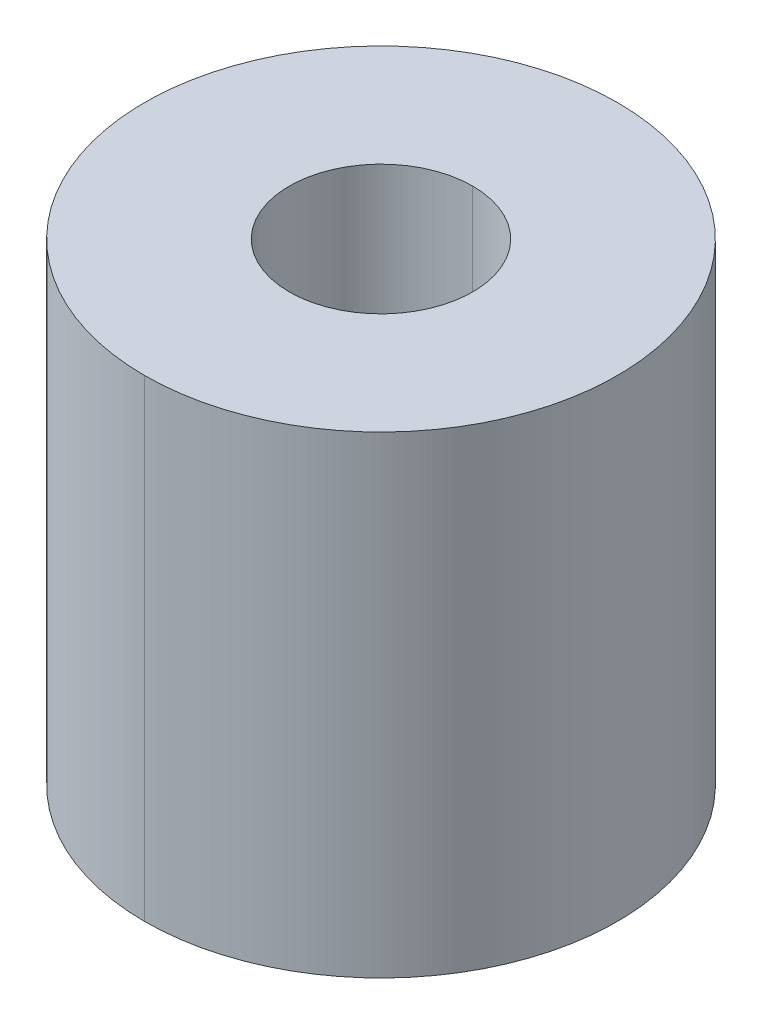
ISO-10303-21;
HEADER;
FILE_DESCRIPTION(('STEP AP214'),'2;1');
FILE_NAME('part.step','',(''),(''),'','','');
FILE_SCHEMA(('AUTOMOTIVE_DESIGN { 1 0 10303 214 1 1 1 1 }'));
ENDSEC;
DATA;
#1=APPLICATION_CONTEXT('core data for automotive mechanical design processes');
#2=APPLICATION_PROTOCOL_DEFINITION('international standard','automotive_design',2000,#1);
#3=PRODUCT_CONTEXT('',#1,'mechanical');
#4=PRODUCT('Part','Part','',(#3));
#5=PRODUCT_RELATED_PRODUCT_CATEGORY('part','',(#4));
#6=PRODUCT_DEFINITION_FORMATION('','',#4);
#7=PRODUCT_DEFINITION_CONTEXT('part definition',#1,'design');
#8=PRODUCT_DEFINITION('design','',#6,#7);
#9=PRODUCT_DEFINITION_SHAPE('','',#8);
#10=(LENGTH_UNIT() NAMED_UNIT(*) SI_UNIT(.MILLI.,.METRE.));
#11=(NAMED_UNIT(*) PLANE_ANGLE_UNIT() SI_UNIT($,.RADIAN.));
#12=(NAMED_UNIT(*) SI_UNIT($,.STERADIAN.) SOLID_ANGLE_UNIT());
#13=UNCERTAINTY_MEASURE_WITH_UNIT(LENGTH_MEASURE(1.E-05),#10,'distance_accuracy_value','');
#14=(GEOMETRIC_REPRESENTATION_CONTEXT(3) GLOBAL_UNCERTAINTY_ASSIGNED_CONTEXT((#13)) GLOBAL_UNIT_ASSIGNED_CONTEXT((#10,
#11,#12)) REPRESENTATION_CONTEXT('',''));
#15=CARTESIAN_POINT('',(0.,0.,0.));
#16=DIRECTION('',(0.,0.,1.));
#17=DIRECTION('',(1.,0.,0.));
#18=AXIS2_PLACEMENT_3D('',#15,#16,#17);
#19=CARTESIAN_POINT('',(0.,-6.35,0.));
#20=DIRECTION('',(0.,1.,0.));
#21=DIRECTION('',(1.,0.,0.));
#22=AXIS2_PLACEMENT_3D('',#19,#20,#21);
#23=PLANE('',#22);
#24=CARTESIAN_POINT('',(0.,-6.35,0.));
#25=DIRECTION('',(0.,1.,0.));
#26=DIRECTION('',(0.,0.,1.));
#27=AXIS2_PLACEMENT_3D('',#24,#25,#26);
#28=CIRCLE('',#27,2.4638);
#29=CARTESIAN_POINT('',(0.,-6.35,-2.4638));
#30=VERTEX_POINT('',#29);
#31=CARTESIAN_POINT('',(0.,-6.35,2.4638));
#32=VERTEX_POINT('',#31);
#33=EDGE_CURVE('E11',#30,#32,#28,.T.);
#34=ORIENTED_EDGE('',*,*,#33,.T.);
#35=CARTESIAN_POINT('',(0.,-6.35,0.));
#36=DIRECTION('',(0.,1.,0.));
#37=DIRECTION('',(0.,0.,1.));
#38=AXIS2_PLACEMENT_3D('',#35,#36,#37);
#39=CIRCLE('',#38,2.4638);
#40=EDGE_CURVE('E27',#32,#30,#39,.T.);
#41=ORIENTED_EDGE('',*,*,#40,.T.);
#42=EDGE_LOOP('',(#34,#41));
#43=FACE_BOUND('',#42,.T.);
#44=CARTESIAN_POINT('',(0.,-6.35,0.));
#45=DIRECTION('',(0.,1.,0.));
#46=DIRECTION('',(0.,0.,1.));
#47=AXIS2_PLACEMENT_3D('',#44,#45,#46);
#48=CIRCLE('',#47,6.35);
#49=CARTESIAN_POINT('',(0.,-6.35,-6.35));
#50=VERTEX_POINT('',#49);
#51=CARTESIAN_POINT('',(0.,-6.35,6.35));
#52=VERTEX_POINT('',#51);
#53=EDGE_CURVE('E75',#50,#52,#48,.T.);
#54=ORIENTED_EDGE('',*,*,#53,.F.);
#55=CARTESIAN_POINT('',(0.,-6.35,0.));
#56=DIRECTION('',(0.,1.,0.));
#57=DIRECTION('',(0.,0.,1.));
#58=AXIS2_PLACEMENT_3D('',#55,#56,#57);
#59=CIRCLE('',#58,6.35);
#60=EDGE_CURVE('E64',#52,#50,#59,.T.);
#61=ORIENTED_EDGE('',*,*,#60,.F.);
#62=EDGE_LOOP('',(#54,#61));
#63=FACE_BOUND('',#62,.T.);
#64=ADVANCED_FACE('F16',(#43,#63),#23,.F.);
#65=CARTESIAN_POINT('',(0.,6.35,0.));
#66=DIRECTION('',(0.,-1.,0.));
#67=DIRECTION('',(0.,0.,-1.));
#68=AXIS2_PLACEMENT_3D('',#65,#66,#67);
#69=CYLINDRICAL_SURFACE('',#68,2.4638);
#70=CARTESIAN_POINT('',(0.,6.35,0.));
#71=DIRECTION('',(0.,1.,0.));
#72=DIRECTION('',(0.,0.,1.));
#73=AXIS2_PLACEMENT_3D('',#70,#71,#72);
#74=CIRCLE('',#73,2.4638);
#75=CARTESIAN_POINT('',(0.,6.35,-2.4638));
#76=VERTEX_POINT('',#75);
#77=CARTESIAN_POINT('',(0.,6.35,2.4638));
#78=VERTEX_POINT('',#77);
#79=EDGE_CURVE('E97',#76,#78,#74,.T.);
#80=ORIENTED_EDGE('',*,*,#79,.T.);
#81=DIRECTION('',(0.,-1.,0.));
#82=VECTOR('',#81,1.);
#83=CARTESIAN_POINT('',(0.,6.35,2.4638));
#84=LINE('',#83,#82);
#85=EDGE_CURVE('E74',#78,#32,#84,.T.);
#86=ORIENTED_EDGE('',*,*,#85,.T.);
#87=ORIENTED_EDGE('',*,*,#33,.F.);
#88=DIRECTION('',(0.,-1.,0.));
#89=VECTOR('',#88,1.);
#90=CARTESIAN_POINT('',(0.,6.35,-2.4638));
#91=LINE('',#90,#89);
#92=EDGE_CURVE('E100',#76,#30,#91,.T.);
#93=ORIENTED_EDGE('',*,*,#92,.F.);
#94=EDGE_LOOP('',(#80,#86,#87,#93));
#95=FACE_BOUND('',#94,.T.);
#96=ADVANCED_FACE('F115',(#95),#69,.F.);
#97=CARTESIAN_POINT('',(0.,6.35,0.));
#98=DIRECTION('',(0.,-1.,0.));
#99=DIRECTION('',(0.,0.,-1.));
#100=AXIS2_PLACEMENT_3D('',#97,#98,#99);
#101=CYLINDRICAL_SURFACE('',#100,2.4638);
#102=ORIENTED_EDGE('',*,*,#85,.F.);
#103=CARTESIAN_POINT('',(0.,6.35,0.));
#104=DIRECTION('',(0.,1.,0.));
#105=DIRECTION('',(0.,0.,1.));
#106=AXIS2_PLACEMENT_3D('',#103,#104,#105);
#107=CIRCLE('',#106,2.4638);
#108=EDGE_CURVE('E90',#78,#76,#107,.T.);
#109=ORIENTED_EDGE('',*,*,#108,.T.);
#110=ORIENTED_EDGE('',*,*,#92,.T.);
#111=ORIENTED_EDGE('',*,*,#40,.F.);
#112=EDGE_LOOP('',(#102,#109,#110,#111));
#113=FACE_BOUND('',#112,.T.);
#114=ADVANCED_FACE('F122',(#113),#101,.F.);
#115=CARTESIAN_POINT('',(0.,6.35,0.));
#116=DIRECTION('',(0.,-1.,0.));
#117=DIRECTION('',(0.,0.,-1.));
#118=AXIS2_PLACEMENT_3D('',#115,#116,#117);
#119=CYLINDRICAL_SURFACE('',#118,6.35);
#120=CARTESIAN_POINT('',(0.,6.35,0.));
#121=DIRECTION('',(0.,1.,0.));
#122=DIRECTION('',(0.,0.,1.));
#123=AXIS2_PLACEMENT_3D('',#120,#121,#122);
#124=CIRCLE('',#123,6.35);
#125=CARTESIAN_POINT('',(0.,6.35,6.35));
#126=VERTEX_POINT('',#125);
#127=CARTESIAN_POINT('',(0.,6.35,-6.35));
#128=VERTEX_POINT('',#127);
#129=EDGE_CURVE('E105',#126,#128,#124,.T.);
#130=ORIENTED_EDGE('',*,*,#129,.F.);
#131=DIRECTION('',(0.,-1.,0.));
#132=VECTOR('',#131,1.);
#133=CARTESIAN_POINT('',(0.,6.35,6.35));
#134=LINE('',#133,#132);
#135=EDGE_CURVE('E70',#126,#52,#134,.T.);
#136=ORIENTED_EDGE('',*,*,#135,.T.);
#137=ORIENTED_EDGE('',*,*,#60,.T.);
#138=DIRECTION('',(0.,-1.,0.));
#139=VECTOR('',#138,1.);
#140=CARTESIAN_POINT('',(0.,6.35,-6.35));
#141=LINE('',#140,#139);
#142=EDGE_CURVE('E20',#128,#50,#141,.T.);
#143=ORIENTED_EDGE('',*,*,#142,.F.);
#144=EDGE_LOOP('',(#130,#136,#137,#143));
#145=FACE_BOUND('',#144,.T.);
#146=ADVANCED_FACE('F18',(#145),#119,.T.);
#147=CARTESIAN_POINT('',(0.,6.35,0.));
#148=DIRECTION('',(0.,-1.,0.));
#149=DIRECTION('',(0.,0.,-1.));
#150=AXIS2_PLACEMENT_3D('',#147,#148,#149);
#151=CYLINDRICAL_SURFACE('',#150,6.35);
#152=ORIENTED_EDGE('',*,*,#135,.F.);
#153=CARTESIAN_POINT('',(0.,6.35,0.));
#154=DIRECTION('',(0.,1.,0.));
#155=DIRECTION('',(0.,0.,1.));
#156=AXIS2_PLACEMENT_3D('',#153,#154,#155);
#157=CIRCLE('',#156,6.35);
#158=EDGE_CURVE('E83',#128,#126,#157,.T.);
#159=ORIENTED_EDGE('',*,*,#158,.F.);
#160=ORIENTED_EDGE('',*,*,#142,.T.);
#161=ORIENTED_EDGE('',*,*,#53,.T.);
#162=EDGE_LOOP('',(#152,#159,#160,#161));
#163=FACE_BOUND('',#162,.T.);
#164=ADVANCED_FACE('F81',(#163),#151,.T.);
#165=CARTESIAN_POINT('',(0.,6.35,0.));
#166=DIRECTION('',(0.,1.,0.));
#167=DIRECTION('',(1.,0.,0.));
#168=AXIS2_PLACEMENT_3D('',#165,#166,#167);
#169=PLANE('',#168);
#170=ORIENTED_EDGE('',*,*,#79,.F.);
#171=ORIENTED_EDGE('',*,*,#108,.F.);
#172=EDGE_LOOP('',(#170,#171));
#173=FACE_BOUND('',#172,.T.);
#174=ORIENTED_EDGE('',*,*,#158,.T.);
#175=ORIENTED_EDGE('',*,*,#129,.T.);
#176=EDGE_LOOP('',(#174,#175));
#177=FACE_BOUND('',#176,.T.);
#178=ADVANCED_FACE('F119',(#173,#177),#169,.T.);
#179=CLOSED_SHELL('',(#64,#96,#114,#146,#164,#178));
#180=MANIFOLD_SOLID_BREP('B1',#179);
#181=ADVANCED_BREP_SHAPE_REPRESENTATION('',(#18,#180),#14);
#182=SHAPE_DEFINITION_REPRESENTATION(#9,#181);
ENDSEC;
END-ISO-10303-21;
